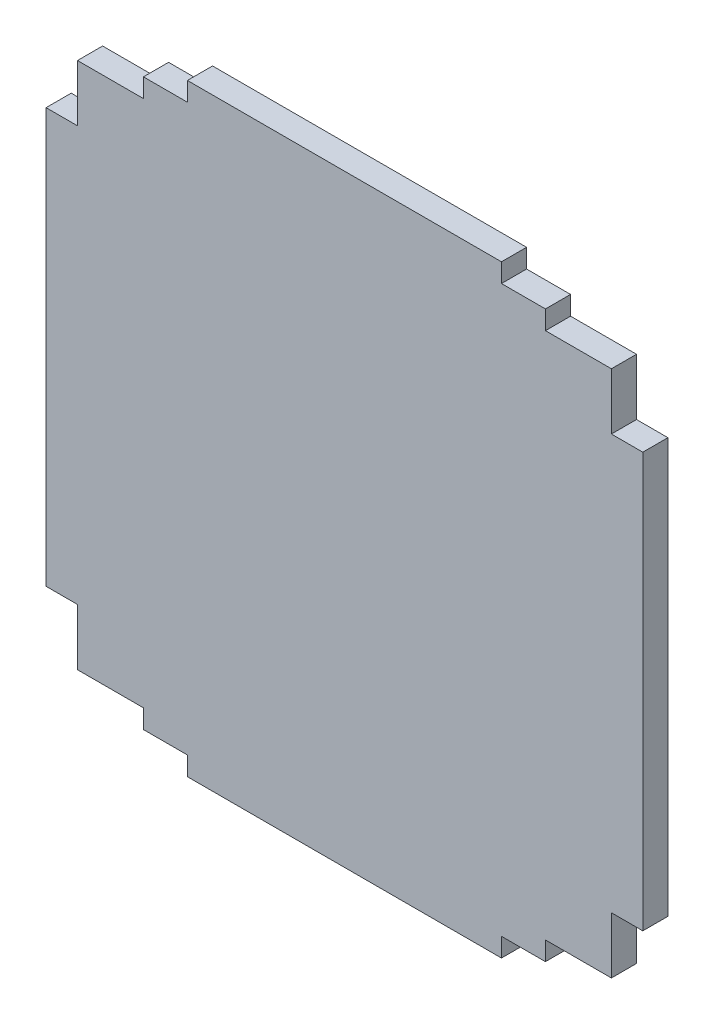
ISO-10303-21;
HEADER;
FILE_DESCRIPTION(('STEP AP214'),'2;1');
FILE_NAME('part.step','',(''),(''),'','','');
FILE_SCHEMA(('AUTOMOTIVE_DESIGN { 1 0 10303 214 1 1 1 1 }'));
ENDSEC;
DATA;
#1=APPLICATION_CONTEXT('core data for automotive mechanical design processes');
#2=APPLICATION_PROTOCOL_DEFINITION('international standard','automotive_design',2000,#1);
#3=PRODUCT_CONTEXT('',#1,'mechanical');
#4=PRODUCT('Part','Part','',(#3));
#5=PRODUCT_RELATED_PRODUCT_CATEGORY('part','',(#4));
#6=PRODUCT_DEFINITION_FORMATION('','',#4);
#7=PRODUCT_DEFINITION_CONTEXT('part definition',#1,'design');
#8=PRODUCT_DEFINITION('design','',#6,#7);
#9=PRODUCT_DEFINITION_SHAPE('','',#8);
#10=(LENGTH_UNIT() NAMED_UNIT(*) SI_UNIT(.MILLI.,.METRE.));
#11=(NAMED_UNIT(*) PLANE_ANGLE_UNIT() SI_UNIT($,.RADIAN.));
#12=(NAMED_UNIT(*) SI_UNIT($,.STERADIAN.) SOLID_ANGLE_UNIT());
#13=UNCERTAINTY_MEASURE_WITH_UNIT(LENGTH_MEASURE(1.E-05),#10,'distance_accuracy_value','');
#14=(GEOMETRIC_REPRESENTATION_CONTEXT(3) GLOBAL_UNCERTAINTY_ASSIGNED_CONTEXT((#13)) GLOBAL_UNIT_ASSIGNED_CONTEXT((#10,
#11,#12)) REPRESENTATION_CONTEXT('',''));
#15=CARTESIAN_POINT('',(0.,0.,0.));
#16=DIRECTION('',(0.,0.,1.));
#17=DIRECTION('',(1.,0.,0.));
#18=AXIS2_PLACEMENT_3D('',#15,#16,#17);
#19=CARTESIAN_POINT('',(42.185985468852,-41.9999998962809,4.));
#20=DIRECTION('',(-0.999999999999999,3.79117308534226E-08,0.));
#21=DIRECTION('',(-3.79117308534226E-08,-0.999999999999999,0.));
#22=AXIS2_PLACEMENT_3D('',#19,#20,#21);
#23=PLANE('',#22);
#24=DIRECTION('',(3.79117308534226E-08,0.999999999999999,0.));
#25=VECTOR('',#24,1.);
#26=CARTESIAN_POINT('',(42.185985468852,-41.9999998962809,0.));
#27=LINE('',#26,#25);
#28=CARTESIAN_POINT('',(42.185985468852,-41.9999998962809,0.));
#29=VERTEX_POINT('',#28);
#30=CARTESIAN_POINT('',(42.1859858100575,-32.9999998962809,0.));
#31=VERTEX_POINT('',#30);
#32=EDGE_CURVE('E255',#29,#31,#27,.T.);
#33=ORIENTED_EDGE('',*,*,#32,.T.);
#34=DIRECTION('',(0.,0.,-1.));
#35=VECTOR('',#34,1.);
#36=CARTESIAN_POINT('',(42.1859858100575,-32.9999998962809,4.));
#37=LINE('',#36,#35);
#38=CARTESIAN_POINT('',(42.1859858100575,-32.9999998962809,4.));
#39=VERTEX_POINT('',#38);
#40=EDGE_CURVE('E11',#39,#31,#37,.T.);
#41=ORIENTED_EDGE('',*,*,#40,.F.);
#42=DIRECTION('',(3.79117308534226E-08,0.999999999999999,0.));
#43=VECTOR('',#42,1.);
#44=CARTESIAN_POINT('',(42.185985468852,-41.9999998962809,4.));
#45=LINE('',#44,#43);
#46=CARTESIAN_POINT('',(42.185985468852,-41.9999998962809,4.));
#47=VERTEX_POINT('',#46);
#48=EDGE_CURVE('E309',#47,#39,#45,.T.);
#49=ORIENTED_EDGE('',*,*,#48,.F.);
#50=DIRECTION('',(0.,0.,-1.));
#51=VECTOR('',#50,1.);
#52=CARTESIAN_POINT('',(42.185985468852,-41.9999998962809,4.));
#53=LINE('',#52,#51);
#54=EDGE_CURVE('E251',#47,#29,#53,.T.);
#55=ORIENTED_EDGE('',*,*,#54,.T.);
#56=EDGE_LOOP('',(#33,#41,#49,#55));
#57=FACE_BOUND('',#56,.T.);
#58=ADVANCED_FACE('F39',(#57),#23,.F.);
#59=CARTESIAN_POINT('',(42.1859858100575,-32.9999998962809,4.));
#60=DIRECTION('',(3.57590861161203E-09,1.,0.));
#61=DIRECTION('',(-1.,3.57590861161203E-09,0.));
#62=AXIS2_PLACEMENT_3D('',#59,#60,#61);
#63=PLANE('',#62);
#64=DIRECTION('',(1.,-3.57590861161203E-09,0.));
#65=VECTOR('',#64,1.);
#66=CARTESIAN_POINT('',(42.1859858100575,-32.9999998962809,0.));
#67=LINE('',#66,#65);
#68=CARTESIAN_POINT('',(47.1859883122317,-32.9999999141604,0.));
#69=VERTEX_POINT('',#68);
#70=EDGE_CURVE('E258',#31,#69,#67,.T.);
#71=ORIENTED_EDGE('',*,*,#70,.T.);
#72=DIRECTION('',(0.,0.,-1.));
#73=VECTOR('',#72,1.);
#74=CARTESIAN_POINT('',(47.1859883122317,-32.9999999141604,4.));
#75=LINE('',#74,#73);
#76=CARTESIAN_POINT('',(47.1859883122317,-32.9999999141604,4.));
#77=VERTEX_POINT('',#76);
#78=EDGE_CURVE('E47',#77,#69,#75,.T.);
#79=ORIENTED_EDGE('',*,*,#78,.F.);
#80=DIRECTION('',(1.,-3.57590861161203E-09,0.));
#81=VECTOR('',#80,1.);
#82=CARTESIAN_POINT('',(42.1859858100575,-32.9999998962809,4.));
#83=LINE('',#82,#81);
#84=EDGE_CURVE('E158',#39,#77,#83,.T.);
#85=ORIENTED_EDGE('',*,*,#84,.F.);
#86=ORIENTED_EDGE('',*,*,#40,.T.);
#87=EDGE_LOOP('',(#71,#79,#85,#86));
#88=FACE_BOUND('',#87,.T.);
#89=ADVANCED_FACE('F467',(#88),#63,.F.);
#90=CARTESIAN_POINT('',(47.1859858100575,33.0000000858395,4.));
#91=DIRECTION('',(-0.999999999999999,-3.79117300473895E-08,0.));
#92=DIRECTION('',(3.79117300473895E-08,-0.999999999999999,0.));
#93=AXIS2_PLACEMENT_3D('',#90,#91,#92);
#94=PLANE('',#93);
#95=DIRECTION('',(-3.79117300473895E-08,0.999999999999999,0.));
#96=VECTOR('',#95,1.);
#97=CARTESIAN_POINT('',(47.1859858100575,33.0000000858395,0.));
#98=LINE('',#97,#96);
#99=CARTESIAN_POINT('',(47.1859858100575,33.0000000858395,0.));
#100=VERTEX_POINT('',#99);
#101=EDGE_CURVE('E260',#69,#100,#98,.T.);
#102=ORIENTED_EDGE('',*,*,#101,.T.);
#103=DIRECTION('',(0.,0.,-1.));
#104=VECTOR('',#103,1.);
#105=CARTESIAN_POINT('',(47.1859858100575,33.0000000858395,4.));
#106=LINE('',#105,#104);
#107=CARTESIAN_POINT('',(47.1859858100575,33.0000000858395,4.));
#108=VERTEX_POINT('',#107);
#109=EDGE_CURVE('E376',#108,#100,#106,.T.);
#110=ORIENTED_EDGE('',*,*,#109,.F.);
#111=DIRECTION('',(-3.79117300473895E-08,0.999999999999999,0.));
#112=VECTOR('',#111,1.);
#113=CARTESIAN_POINT('',(47.1859858100575,33.0000000858395,4.));
#114=LINE('',#113,#112);
#115=EDGE_CURVE('E384',#77,#108,#114,.T.);
#116=ORIENTED_EDGE('',*,*,#115,.F.);
#117=ORIENTED_EDGE('',*,*,#78,.T.);
#118=EDGE_LOOP('',(#102,#110,#116,#117));
#119=FACE_BOUND('',#118,.T.);
#120=ADVANCED_FACE('F382',(#119),#94,.F.);
#121=CARTESIAN_POINT('',(42.1859858100575,32.9999998962809,4.));
#122=DIRECTION('',(3.79117293114462E-08,-0.999999999999999,0.));
#123=DIRECTION('',(0.999999999999999,3.79117293114462E-08,0.));
#124=AXIS2_PLACEMENT_3D('',#121,#122,#123);
#125=PLANE('',#124);
#126=DIRECTION('',(-0.999999999999999,-3.79117293114462E-08,0.));
#127=VECTOR('',#126,1.);
#128=CARTESIAN_POINT('',(42.1859858100575,32.9999998962809,0.));
#129=LINE('',#128,#127);
#130=CARTESIAN_POINT('',(42.1859858100575,32.9999998962809,0.));
#131=VERTEX_POINT('',#130);
#132=EDGE_CURVE('E262',#100,#131,#129,.T.);
#133=ORIENTED_EDGE('',*,*,#132,.T.);
#134=DIRECTION('',(0.,0.,-1.));
#135=VECTOR('',#134,1.);
#136=CARTESIAN_POINT('',(42.1859858100575,32.9999998962809,4.));
#137=LINE('',#136,#135);
#138=CARTESIAN_POINT('',(42.1859858100575,32.9999998962809,4.));
#139=VERTEX_POINT('',#138);
#140=EDGE_CURVE('E373',#139,#131,#137,.T.);
#141=ORIENTED_EDGE('',*,*,#140,.F.);
#142=DIRECTION('',(-0.999999999999999,-3.79117293114462E-08,0.));
#143=VECTOR('',#142,1.);
#144=CARTESIAN_POINT('',(42.1859858100575,32.9999998962809,4.));
#145=LINE('',#144,#143);
#146=EDGE_CURVE('E402',#108,#139,#145,.T.);
#147=ORIENTED_EDGE('',*,*,#146,.F.);
#148=ORIENTED_EDGE('',*,*,#109,.T.);
#149=EDGE_LOOP('',(#133,#141,#147,#148));
#150=FACE_BOUND('',#149,.T.);
#151=ADVANCED_FACE('F393',(#150),#125,.F.);
#152=CARTESIAN_POINT('',(42.185985468852,41.9999998962809,4.));
#153=DIRECTION('',(-0.999999999999999,-3.79117308534226E-08,0.));
#154=DIRECTION('',(3.79117308534226E-08,-0.999999999999999,0.));
#155=AXIS2_PLACEMENT_3D('',#152,#153,#154);
#156=PLANE('',#155);
#157=DIRECTION('',(-3.79117308534226E-08,0.999999999999999,0.));
#158=VECTOR('',#157,1.);
#159=CARTESIAN_POINT('',(42.185985468852,41.9999998962809,0.));
#160=LINE('',#159,#158);
#161=CARTESIAN_POINT('',(42.185985468852,41.9999998962809,0.));
#162=VERTEX_POINT('',#161);
#163=EDGE_CURVE('E264',#131,#162,#160,.T.);
#164=ORIENTED_EDGE('',*,*,#163,.T.);
#165=DIRECTION('',(0.,0.,-1.));
#166=VECTOR('',#165,1.);
#167=CARTESIAN_POINT('',(42.185985468852,41.9999998962809,4.));
#168=LINE('',#167,#166);
#169=CARTESIAN_POINT('',(42.185985468852,41.9999998962809,4.));
#170=VERTEX_POINT('',#169);
#171=EDGE_CURVE('E370',#170,#162,#168,.T.);
#172=ORIENTED_EDGE('',*,*,#171,.F.);
#173=DIRECTION('',(-3.79117308534226E-08,0.999999999999999,0.));
#174=VECTOR('',#173,1.);
#175=CARTESIAN_POINT('',(42.185985468852,41.9999998962809,4.));
#176=LINE('',#175,#174);
#177=EDGE_CURVE('E399',#139,#170,#176,.T.);
#178=ORIENTED_EDGE('',*,*,#177,.F.);
#179=ORIENTED_EDGE('',*,*,#140,.T.);
#180=EDGE_LOOP('',(#164,#172,#178,#179));
#181=FACE_BOUND('',#180,.T.);
#182=ADVANCED_FACE('F397',(#181),#156,.F.);
#183=CARTESIAN_POINT('',(31.6859854688523,41.9999994982078,4.));
#184=DIRECTION('',(3.79117200595888E-08,-0.999999999999999,0.));
#185=DIRECTION('',(0.999999999999999,3.79117200595888E-08,0.));
#186=AXIS2_PLACEMENT_3D('',#183,#184,#185);
#187=PLANE('',#186);
#188=DIRECTION('',(-0.999999999999999,-3.79117200595888E-08,0.));
#189=VECTOR('',#188,1.);
#190=CARTESIAN_POINT('',(31.6859854688523,41.9999994982078,0.));
#191=LINE('',#190,#189);
#192=CARTESIAN_POINT('',(31.6859854688523,41.9999994982078,0.));
#193=VERTEX_POINT('',#192);
#194=EDGE_CURVE('E266',#162,#193,#191,.T.);
#195=ORIENTED_EDGE('',*,*,#194,.T.);
#196=DIRECTION('',(0.,0.,-1.));
#197=VECTOR('',#196,1.);
#198=CARTESIAN_POINT('',(31.6859854688523,41.9999994982078,4.));
#199=LINE('',#198,#197);
#200=CARTESIAN_POINT('',(31.6859854688523,41.9999994982078,4.));
#201=VERTEX_POINT('',#200);
#202=EDGE_CURVE('E367',#201,#193,#199,.T.);
#203=ORIENTED_EDGE('',*,*,#202,.F.);
#204=DIRECTION('',(-0.999999999999999,-3.79117200595888E-08,0.));
#205=VECTOR('',#204,1.);
#206=CARTESIAN_POINT('',(31.6859854688523,41.9999994982078,4.));
#207=LINE('',#206,#205);
#208=EDGE_CURVE('E401',#170,#201,#207,.T.);
#209=ORIENTED_EDGE('',*,*,#208,.F.);
#210=ORIENTED_EDGE('',*,*,#171,.T.);
#211=EDGE_LOOP('',(#195,#203,#209,#210));
#212=FACE_BOUND('',#211,.T.);
#213=ADVANCED_FACE('F480',(#212),#187,.F.);
#214=CARTESIAN_POINT('',(31.6859853551171,44.9999994982078,4.));
#215=DIRECTION('',(-0.999999999999999,-3.79117293114463E-08,0.));
#216=DIRECTION('',(3.79117293114463E-08,-0.999999999999999,0.));
#217=AXIS2_PLACEMENT_3D('',#214,#215,#216);
#218=PLANE('',#217);
#219=DIRECTION('',(-3.79117293114463E-08,0.999999999999999,0.));
#220=VECTOR('',#219,1.);
#221=CARTESIAN_POINT('',(31.6859853551171,44.9999994982078,0.));
#222=LINE('',#221,#220);
#223=CARTESIAN_POINT('',(31.6859853551171,44.9999994982078,0.));
#224=VERTEX_POINT('',#223);
#225=EDGE_CURVE('E268',#193,#224,#222,.T.);
#226=ORIENTED_EDGE('',*,*,#225,.T.);
#227=DIRECTION('',(0.,0.,-1.));
#228=VECTOR('',#227,1.);
#229=CARTESIAN_POINT('',(31.6859853551171,44.9999994982078,4.));
#230=LINE('',#229,#228);
#231=CARTESIAN_POINT('',(31.6859853551171,44.9999994982078,4.));
#232=VERTEX_POINT('',#231);
#233=EDGE_CURVE('E364',#232,#224,#230,.T.);
#234=ORIENTED_EDGE('',*,*,#233,.F.);
#235=DIRECTION('',(-3.79117293114463E-08,0.999999999999999,0.));
#236=VECTOR('',#235,1.);
#237=CARTESIAN_POINT('',(31.6859853551171,44.9999994982078,4.));
#238=LINE('',#237,#236);
#239=EDGE_CURVE('E404',#201,#232,#238,.T.);
#240=ORIENTED_EDGE('',*,*,#239,.F.);
#241=ORIENTED_EDGE('',*,*,#202,.T.);
#242=EDGE_LOOP('',(#226,#234,#240,#241));
#243=FACE_BOUND('',#242,.T.);
#244=ADVANCED_FACE('F483',(#243),#218,.F.);
#245=CARTESIAN_POINT('',(24.6859853551169,44.9999992328257,4.));
#246=DIRECTION('',(3.79117303027153E-08,-0.999999999999999,0.));
#247=DIRECTION('',(0.999999999999999,3.79117303027153E-08,0.));
#248=AXIS2_PLACEMENT_3D('',#245,#246,#247);
#249=PLANE('',#248);
#250=DIRECTION('',(-0.999999999999999,-3.79117303027153E-08,0.));
#251=VECTOR('',#250,1.);
#252=CARTESIAN_POINT('',(24.6859853551169,44.9999992328257,0.));
#253=LINE('',#252,#251);
#254=CARTESIAN_POINT('',(24.6859853551169,44.9999992328257,0.));
#255=VERTEX_POINT('',#254);
#256=EDGE_CURVE('E270',#224,#255,#253,.T.);
#257=ORIENTED_EDGE('',*,*,#256,.T.);
#258=DIRECTION('',(0.,0.,-1.));
#259=VECTOR('',#258,1.);
#260=CARTESIAN_POINT('',(24.6859853551169,44.9999992328257,4.));
#261=LINE('',#260,#259);
#262=CARTESIAN_POINT('',(24.6859853551169,44.9999992328257,4.));
#263=VERTEX_POINT('',#262);
#264=EDGE_CURVE('E361',#263,#255,#261,.T.);
#265=ORIENTED_EDGE('',*,*,#264,.F.);
#266=DIRECTION('',(-0.999999999999999,-3.79117303027153E-08,0.));
#267=VECTOR('',#266,1.);
#268=CARTESIAN_POINT('',(24.6859853551169,44.9999992328257,4.));
#269=LINE('',#268,#267);
#270=EDGE_CURVE('E410',#232,#263,#269,.T.);
#271=ORIENTED_EDGE('',*,*,#270,.F.);
#272=ORIENTED_EDGE('',*,*,#233,.T.);
#273=EDGE_LOOP('',(#257,#265,#271,#272));
#274=FACE_BOUND('',#273,.T.);
#275=ADVANCED_FACE('F487',(#274),#249,.F.);
#276=CARTESIAN_POINT('',(24.6859852413817,47.9999992328257,4.));
#277=DIRECTION('',(-0.999999999999999,-3.79117293114461E-08,0.));
#278=DIRECTION('',(3.79117293114461E-08,-0.999999999999999,0.));
#279=AXIS2_PLACEMENT_3D('',#276,#277,#278);
#280=PLANE('',#279);
#281=DIRECTION('',(-3.79117293114461E-08,0.999999999999999,0.));
#282=VECTOR('',#281,1.);
#283=CARTESIAN_POINT('',(24.6859852413817,47.9999992328257,0.));
#284=LINE('',#283,#282);
#285=CARTESIAN_POINT('',(24.6859852413817,47.9999992328257,0.));
#286=VERTEX_POINT('',#285);
#287=EDGE_CURVE('E272',#255,#286,#284,.T.);
#288=ORIENTED_EDGE('',*,*,#287,.T.);
#289=DIRECTION('',(0.,0.,-1.));
#290=VECTOR('',#289,1.);
#291=CARTESIAN_POINT('',(24.6859852413817,47.9999992328257,4.));
#292=LINE('',#291,#290);
#293=CARTESIAN_POINT('',(24.6859852413817,47.9999992328257,4.));
#294=VERTEX_POINT('',#293);
#295=EDGE_CURVE('E358',#294,#286,#292,.T.);
#296=ORIENTED_EDGE('',*,*,#295,.F.);
#297=DIRECTION('',(-3.79117293114461E-08,0.999999999999999,0.));
#298=VECTOR('',#297,1.);
#299=CARTESIAN_POINT('',(24.6859852413817,47.9999992328257,4.));
#300=LINE('',#299,#298);
#301=EDGE_CURVE('E412',#263,#294,#300,.T.);
#302=ORIENTED_EDGE('',*,*,#301,.F.);
#303=ORIENTED_EDGE('',*,*,#264,.T.);
#304=EDGE_LOOP('',(#288,#296,#302,#303));
#305=FACE_BOUND('',#304,.T.);
#306=ADVANCED_FACE('F491',(#305),#280,.F.);
#307=CARTESIAN_POINT('',(-25.3140147586183,47.9999973372392,4.));
#308=DIRECTION('',(3.79117302828913E-08,-0.999999999999999,0.));
#309=DIRECTION('',(0.999999999999999,3.79117302828913E-08,0.));
#310=AXIS2_PLACEMENT_3D('',#307,#308,#309);
#311=PLANE('',#310);
#312=DIRECTION('',(-0.999999999999999,-3.79117302828913E-08,0.));
#313=VECTOR('',#312,1.);
#314=CARTESIAN_POINT('',(-25.3140147586183,47.9999973372392,0.));
#315=LINE('',#314,#313);
#316=CARTESIAN_POINT('',(-25.3140147586183,47.9999973372392,0.));
#317=VERTEX_POINT('',#316);
#318=EDGE_CURVE('E274',#286,#317,#315,.T.);
#319=ORIENTED_EDGE('',*,*,#318,.T.);
#320=DIRECTION('',(0.,0.,-1.));
#321=VECTOR('',#320,1.);
#322=CARTESIAN_POINT('',(-25.3140147586183,47.9999973372392,4.));
#323=LINE('',#322,#321);
#324=CARTESIAN_POINT('',(-25.3140147586183,47.9999973372392,4.));
#325=VERTEX_POINT('',#324);
#326=EDGE_CURVE('E355',#325,#317,#323,.T.);
#327=ORIENTED_EDGE('',*,*,#326,.F.);
#328=DIRECTION('',(-0.999999999999999,-3.79117302828913E-08,0.));
#329=VECTOR('',#328,1.);
#330=CARTESIAN_POINT('',(-25.3140147586183,47.9999973372392,4.));
#331=LINE('',#330,#329);
#332=EDGE_CURVE('E414',#294,#325,#331,.T.);
#333=ORIENTED_EDGE('',*,*,#332,.F.);
#334=ORIENTED_EDGE('',*,*,#295,.T.);
#335=EDGE_LOOP('',(#319,#327,#333,#334));
#336=FACE_BOUND('',#335,.T.);
#337=ADVANCED_FACE('F495',(#336),#311,.F.);
#338=CARTESIAN_POINT('',(-25.3140146448831,44.9999973372392,4.));
#339=DIRECTION('',(0.999999999999999,3.79117304679285E-08,0.));
#340=DIRECTION('',(-3.79117304679285E-08,0.999999999999999,0.));
#341=AXIS2_PLACEMENT_3D('',#338,#339,#340);
#342=PLANE('',#341);
#343=DIRECTION('',(3.79117304679285E-08,-0.999999999999999,0.));
#344=VECTOR('',#343,1.);
#345=CARTESIAN_POINT('',(-25.3140146448831,44.9999973372392,0.));
#346=LINE('',#345,#344);
#347=CARTESIAN_POINT('',(-25.3140146448831,44.9999973372392,0.));
#348=VERTEX_POINT('',#347);
#349=EDGE_CURVE('E276',#317,#348,#346,.T.);
#350=ORIENTED_EDGE('',*,*,#349,.T.);
#351=DIRECTION('',(0.,0.,-1.));
#352=VECTOR('',#351,1.);
#353=CARTESIAN_POINT('',(-25.3140146448831,44.9999973372392,4.));
#354=LINE('',#353,#352);
#355=CARTESIAN_POINT('',(-25.3140146448831,44.9999973372392,4.));
#356=VERTEX_POINT('',#355);
#357=EDGE_CURVE('E352',#356,#348,#354,.T.);
#358=ORIENTED_EDGE('',*,*,#357,.F.);
#359=DIRECTION('',(3.79117304679285E-08,-0.999999999999999,0.));
#360=VECTOR('',#359,1.);
#361=CARTESIAN_POINT('',(-25.3140146448831,44.9999973372392,4.));
#362=LINE('',#361,#360);
#363=EDGE_CURVE('E416',#325,#356,#362,.T.);
#364=ORIENTED_EDGE('',*,*,#363,.F.);
#365=ORIENTED_EDGE('',*,*,#326,.T.);
#366=EDGE_LOOP('',(#350,#358,#364,#365));
#367=FACE_BOUND('',#366,.T.);
#368=ADVANCED_FACE('F499',(#367),#342,.F.);
#369=CARTESIAN_POINT('',(-32.3140146448834,44.9999970718571,4.));
#370=DIRECTION('',(3.79117303027152E-08,-0.999999999999999,0.));
#371=DIRECTION('',(0.999999999999999,3.79117303027152E-08,0.));
#372=AXIS2_PLACEMENT_3D('',#369,#370,#371);
#373=PLANE('',#372);
#374=DIRECTION('',(-0.999999999999999,-3.79117303027152E-08,0.));
#375=VECTOR('',#374,1.);
#376=CARTESIAN_POINT('',(-32.3140146448834,44.9999970718571,0.));
#377=LINE('',#376,#375);
#378=CARTESIAN_POINT('',(-32.3140146448834,44.9999970718571,0.));
#379=VERTEX_POINT('',#378);
#380=EDGE_CURVE('E278',#348,#379,#377,.T.);
#381=ORIENTED_EDGE('',*,*,#380,.T.);
#382=DIRECTION('',(0.,0.,-1.));
#383=VECTOR('',#382,1.);
#384=CARTESIAN_POINT('',(-32.3140146448834,44.9999970718571,4.));
#385=LINE('',#384,#383);
#386=CARTESIAN_POINT('',(-32.3140146448834,44.9999970718571,4.));
#387=VERTEX_POINT('',#386);
#388=EDGE_CURVE('E349',#387,#379,#385,.T.);
#389=ORIENTED_EDGE('',*,*,#388,.F.);
#390=DIRECTION('',(-0.999999999999999,-3.79117303027152E-08,0.));
#391=VECTOR('',#390,1.);
#392=CARTESIAN_POINT('',(-32.3140146448834,44.9999970718571,4.));
#393=LINE('',#392,#391);
#394=EDGE_CURVE('E418',#356,#387,#393,.T.);
#395=ORIENTED_EDGE('',*,*,#394,.F.);
#396=ORIENTED_EDGE('',*,*,#357,.T.);
#397=EDGE_LOOP('',(#381,#389,#395,#396));
#398=FACE_BOUND('',#397,.T.);
#399=ADVANCED_FACE('F503',(#398),#373,.F.);
#400=CARTESIAN_POINT('',(-32.3140145311482,41.9999970718571,4.));
#401=DIRECTION('',(0.999999999999999,3.79117316244108E-08,0.));
#402=DIRECTION('',(-3.79117316244108E-08,0.999999999999999,0.));
#403=AXIS2_PLACEMENT_3D('',#400,#401,#402);
#404=PLANE('',#403);
#405=DIRECTION('',(3.79117316244108E-08,-0.999999999999999,0.));
#406=VECTOR('',#405,1.);
#407=CARTESIAN_POINT('',(-32.3140145311482,41.9999970718571,0.));
#408=LINE('',#407,#406);
#409=CARTESIAN_POINT('',(-32.3140145311482,41.9999970718571,0.));
#410=VERTEX_POINT('',#409);
#411=EDGE_CURVE('E280',#379,#410,#408,.T.);
#412=ORIENTED_EDGE('',*,*,#411,.T.);
#413=DIRECTION('',(0.,0.,-1.));
#414=VECTOR('',#413,1.);
#415=CARTESIAN_POINT('',(-32.3140145311482,41.9999970718571,4.));
#416=LINE('',#415,#414);
#417=CARTESIAN_POINT('',(-32.3140145311482,41.9999970718571,4.));
#418=VERTEX_POINT('',#417);
#419=EDGE_CURVE('E346',#418,#410,#416,.T.);
#420=ORIENTED_EDGE('',*,*,#419,.F.);
#421=DIRECTION('',(3.79117316244108E-08,-0.999999999999999,0.));
#422=VECTOR('',#421,1.);
#423=CARTESIAN_POINT('',(-32.3140145311482,41.9999970718571,4.));
#424=LINE('',#423,#422);
#425=EDGE_CURVE('E420',#387,#418,#424,.T.);
#426=ORIENTED_EDGE('',*,*,#425,.F.);
#427=ORIENTED_EDGE('',*,*,#388,.T.);
#428=EDGE_LOOP('',(#412,#420,#426,#427));
#429=FACE_BOUND('',#428,.T.);
#430=ADVANCED_FACE('F507',(#429),#404,.F.);
#431=CARTESIAN_POINT('',(-42.814014531148,41.9999966737837,4.));
#432=DIRECTION('',(3.79117484760109E-08,-0.999999999999999,0.));
#433=DIRECTION('',(0.999999999999999,3.79117484760109E-08,0.));
#434=AXIS2_PLACEMENT_3D('',#431,#432,#433);
#435=PLANE('',#434);
#436=DIRECTION('',(-0.999999999999999,-3.79117484760109E-08,0.));
#437=VECTOR('',#436,1.);
#438=CARTESIAN_POINT('',(-42.814014531148,41.9999966737837,0.));
#439=LINE('',#438,#437);
#440=CARTESIAN_POINT('',(-42.814014531148,41.9999966737837,0.));
#441=VERTEX_POINT('',#440);
#442=EDGE_CURVE('E282',#410,#441,#439,.T.);
#443=ORIENTED_EDGE('',*,*,#442,.T.);
#444=DIRECTION('',(0.,0.,-1.));
#445=VECTOR('',#444,1.);
#446=CARTESIAN_POINT('',(-42.814014531148,41.9999966737837,4.));
#447=LINE('',#446,#445);
#448=CARTESIAN_POINT('',(-42.814014531148,41.9999966737837,4.));
#449=VERTEX_POINT('',#448);
#450=EDGE_CURVE('E343',#449,#441,#447,.T.);
#451=ORIENTED_EDGE('',*,*,#450,.F.);
#452=DIRECTION('',(-0.999999999999999,-3.79117484760109E-08,0.));
#453=VECTOR('',#452,1.);
#454=CARTESIAN_POINT('',(-42.814014531148,41.9999966737837,4.));
#455=LINE('',#454,#453);
#456=EDGE_CURVE('E422',#418,#449,#455,.T.);
#457=ORIENTED_EDGE('',*,*,#456,.F.);
#458=ORIENTED_EDGE('',*,*,#419,.T.);
#459=EDGE_LOOP('',(#443,#451,#457,#458));
#460=FACE_BOUND('',#459,.T.);
#461=ADVANCED_FACE('F511',(#460),#435,.F.);
#462=CARTESIAN_POINT('',(-42.8140141899426,32.9999966737837,4.));
#463=DIRECTION('',(0.999999999999999,3.79117108077292E-08,0.));
#464=DIRECTION('',(-3.79117108077292E-08,0.999999999999999,0.));
#465=AXIS2_PLACEMENT_3D('',#462,#463,#464);
#466=PLANE('',#465);
#467=DIRECTION('',(3.79117108077292E-08,-0.999999999999999,0.));
#468=VECTOR('',#467,1.);
#469=CARTESIAN_POINT('',(-42.8140141899426,32.9999966737837,0.));
#470=LINE('',#469,#468);
#471=CARTESIAN_POINT('',(-42.8140141899426,32.9999966737837,0.));
#472=VERTEX_POINT('',#471);
#473=EDGE_CURVE('E284',#441,#472,#470,.T.);
#474=ORIENTED_EDGE('',*,*,#473,.T.);
#475=DIRECTION('',(0.,0.,-1.));
#476=VECTOR('',#475,1.);
#477=CARTESIAN_POINT('',(-42.8140141899426,32.9999966737837,4.));
#478=LINE('',#477,#476);
#479=CARTESIAN_POINT('',(-42.8140141899426,32.9999966737837,4.));
#480=VERTEX_POINT('',#479);
#481=EDGE_CURVE('E340',#480,#472,#478,.T.);
#482=ORIENTED_EDGE('',*,*,#481,.F.);
#483=DIRECTION('',(3.79117108077292E-08,-0.999999999999999,0.));
#484=VECTOR('',#483,1.);
#485=CARTESIAN_POINT('',(-42.8140141899426,32.9999966737837,4.));
#486=LINE('',#485,#484);
#487=EDGE_CURVE('E424',#449,#480,#486,.T.);
#488=ORIENTED_EDGE('',*,*,#487,.F.);
#489=ORIENTED_EDGE('',*,*,#450,.T.);
#490=EDGE_LOOP('',(#474,#482,#488,#489));
#491=FACE_BOUND('',#490,.T.);
#492=ADVANCED_FACE('F515',(#491),#466,.F.);
#493=CARTESIAN_POINT('',(-47.8140141899424,32.9999964842251,4.));
#494=DIRECTION('',(3.79117320870051E-08,-0.999999999999999,0.));
#495=DIRECTION('',(0.999999999999999,3.79117320870051E-08,0.));
#496=AXIS2_PLACEMENT_3D('',#493,#494,#495);
#497=PLANE('',#496);
#498=DIRECTION('',(-0.999999999999999,-3.79117320870051E-08,0.));
#499=VECTOR('',#498,1.);
#500=CARTESIAN_POINT('',(-47.8140141899424,32.9999964842251,0.));
#501=LINE('',#500,#499);
#502=CARTESIAN_POINT('',(-47.8140141899424,32.9999964842251,0.));
#503=VERTEX_POINT('',#502);
#504=EDGE_CURVE('E286',#472,#503,#501,.T.);
#505=ORIENTED_EDGE('',*,*,#504,.T.);
#506=DIRECTION('',(0.,0.,-1.));
#507=VECTOR('',#506,1.);
#508=CARTESIAN_POINT('',(-47.8140141899424,32.9999964842251,4.));
#509=LINE('',#508,#507);
#510=CARTESIAN_POINT('',(-47.8140141899424,32.9999964842251,4.));
#511=VERTEX_POINT('',#510);
#512=EDGE_CURVE('E337',#511,#503,#509,.T.);
#513=ORIENTED_EDGE('',*,*,#512,.F.);
#514=DIRECTION('',(-0.999999999999999,-3.79117320870051E-08,0.));
#515=VECTOR('',#514,1.);
#516=CARTESIAN_POINT('',(-47.8140141899424,32.9999964842251,4.));
#517=LINE('',#516,#515);
#518=EDGE_CURVE('E426',#480,#511,#517,.T.);
#519=ORIENTED_EDGE('',*,*,#518,.F.);
#520=ORIENTED_EDGE('',*,*,#481,.T.);
#521=EDGE_LOOP('',(#505,#513,#519,#520));
#522=FACE_BOUND('',#521,.T.);
#523=ADVANCED_FACE('F519',(#522),#497,.F.);
#524=CARTESIAN_POINT('',(-47.8140141899424,32.9999964842251,4.));
#525=DIRECTION('',(1.,0.,0.));
#526=DIRECTION('',(0.,0.,-1.));
#527=AXIS2_PLACEMENT_3D('',#524,#525,#526);
#528=PLANE('',#527);
#529=DIRECTION('',(0.,-1.,0.));
#530=VECTOR('',#529,1.);
#531=CARTESIAN_POINT('',(-47.8140141899424,32.9999964842251,0.));
#532=LINE('',#531,#530);
#533=CARTESIAN_POINT('',(-47.8140141899424,-32.9999964842251,0.));
#534=VERTEX_POINT('',#533);
#535=EDGE_CURVE('E288',#503,#534,#532,.T.);
#536=ORIENTED_EDGE('',*,*,#535,.T.);
#537=DIRECTION('',(0.,0.,-1.));
#538=VECTOR('',#537,1.);
#539=CARTESIAN_POINT('',(-47.8140141899424,-32.9999964842251,4.));
#540=LINE('',#539,#538);
#541=CARTESIAN_POINT('',(-47.8140141899424,-32.9999964842251,4.));
#542=VERTEX_POINT('',#541);
#543=EDGE_CURVE('E334',#542,#534,#540,.T.);
#544=ORIENTED_EDGE('',*,*,#543,.F.);
#545=DIRECTION('',(0.,-1.,0.));
#546=VECTOR('',#545,1.);
#547=CARTESIAN_POINT('',(-47.8140141899424,32.9999964842251,4.));
#548=LINE('',#547,#546);
#549=EDGE_CURVE('E428',#511,#542,#548,.T.);
#550=ORIENTED_EDGE('',*,*,#549,.F.);
#551=ORIENTED_EDGE('',*,*,#512,.T.);
#552=EDGE_LOOP('',(#536,#544,#550,#551));
#553=FACE_BOUND('',#552,.T.);
#554=ADVANCED_FACE('F523',(#553),#528,.F.);
#555=CARTESIAN_POINT('',(-47.8140141899424,-32.9999964842251,4.));
#556=DIRECTION('',(3.79117320870051E-08,0.999999999999999,0.));
#557=DIRECTION('',(-0.999999999999999,3.79117320870051E-08,0.));
#558=AXIS2_PLACEMENT_3D('',#555,#556,#557);
#559=PLANE('',#558);
#560=DIRECTION('',(0.999999999999999,-3.79117320870051E-08,0.));
#561=VECTOR('',#560,1.);
#562=CARTESIAN_POINT('',(-47.8140141899424,-32.9999964842251,0.));
#563=LINE('',#562,#561);
#564=CARTESIAN_POINT('',(-42.8140141899426,-32.9999966737837,0.));
#565=VERTEX_POINT('',#564);
#566=EDGE_CURVE('E290',#534,#565,#563,.T.);
#567=ORIENTED_EDGE('',*,*,#566,.T.);
#568=DIRECTION('',(0.,0.,-1.));
#569=VECTOR('',#568,1.);
#570=CARTESIAN_POINT('',(-42.8140141899426,-32.9999966737837,4.));
#571=LINE('',#570,#569);
#572=CARTESIAN_POINT('',(-42.8140141899426,-32.9999966737837,4.));
#573=VERTEX_POINT('',#572);
#574=EDGE_CURVE('E331',#573,#565,#571,.T.);
#575=ORIENTED_EDGE('',*,*,#574,.F.);
#576=DIRECTION('',(0.999999999999999,-3.79117320870051E-08,0.));
#577=VECTOR('',#576,1.);
#578=CARTESIAN_POINT('',(-47.8140141899424,-32.9999964842251,4.));
#579=LINE('',#578,#577);
#580=EDGE_CURVE('E430',#542,#573,#579,.T.);
#581=ORIENTED_EDGE('',*,*,#580,.F.);
#582=ORIENTED_EDGE('',*,*,#543,.T.);
#583=EDGE_LOOP('',(#567,#575,#581,#582));
#584=FACE_BOUND('',#583,.T.);
#585=ADVANCED_FACE('F527',(#584),#559,.F.);
#586=CARTESIAN_POINT('',(-42.8140141899426,-32.9999966737837,4.));
#587=DIRECTION('',(0.999999999999999,-3.79117108077292E-08,0.));
#588=DIRECTION('',(3.79117108077292E-08,0.999999999999999,0.));
#589=AXIS2_PLACEMENT_3D('',#586,#587,#588);
#590=PLANE('',#589);
#591=DIRECTION('',(-3.79117108077292E-08,-0.999999999999999,0.));
#592=VECTOR('',#591,1.);
#593=CARTESIAN_POINT('',(-42.8140141899426,-32.9999966737837,0.));
#594=LINE('',#593,#592);
#595=CARTESIAN_POINT('',(-42.814014531148,-41.9999966737837,0.));
#596=VERTEX_POINT('',#595);
#597=EDGE_CURVE('E292',#565,#596,#594,.T.);
#598=ORIENTED_EDGE('',*,*,#597,.T.);
#599=DIRECTION('',(0.,0.,-1.));
#600=VECTOR('',#599,1.);
#601=CARTESIAN_POINT('',(-42.814014531148,-41.9999966737837,4.));
#602=LINE('',#601,#600);
#603=CARTESIAN_POINT('',(-42.814014531148,-41.9999966737837,4.));
#604=VERTEX_POINT('',#603);
#605=EDGE_CURVE('E328',#604,#596,#602,.T.);
#606=ORIENTED_EDGE('',*,*,#605,.F.);
#607=DIRECTION('',(-3.79117108077292E-08,-0.999999999999999,0.));
#608=VECTOR('',#607,1.);
#609=CARTESIAN_POINT('',(-42.8140141899426,-32.9999966737837,4.));
#610=LINE('',#609,#608);
#611=EDGE_CURVE('E432',#573,#604,#610,.T.);
#612=ORIENTED_EDGE('',*,*,#611,.F.);
#613=ORIENTED_EDGE('',*,*,#574,.T.);
#614=EDGE_LOOP('',(#598,#606,#612,#613));
#615=FACE_BOUND('',#614,.T.);
#616=ADVANCED_FACE('F531',(#615),#590,.F.);
#617=CARTESIAN_POINT('',(-42.814014531148,-41.9999966737837,4.));
#618=DIRECTION('',(3.79117484760109E-08,0.999999999999999,0.));
#619=DIRECTION('',(-0.999999999999999,3.79117484760109E-08,0.));
#620=AXIS2_PLACEMENT_3D('',#617,#618,#619);
#621=PLANE('',#620);
#622=DIRECTION('',(0.999999999999999,-3.79117484760109E-08,0.));
#623=VECTOR('',#622,1.);
#624=CARTESIAN_POINT('',(-42.814014531148,-41.9999966737837,0.));
#625=LINE('',#624,#623);
#626=CARTESIAN_POINT('',(-32.3140145311482,-41.9999970718571,0.));
#627=VERTEX_POINT('',#626);
#628=EDGE_CURVE('E294',#596,#627,#625,.T.);
#629=ORIENTED_EDGE('',*,*,#628,.T.);
#630=DIRECTION('',(0.,0.,-1.));
#631=VECTOR('',#630,1.);
#632=CARTESIAN_POINT('',(-32.3140145311482,-41.9999970718571,4.));
#633=LINE('',#632,#631);
#634=CARTESIAN_POINT('',(-32.3140145311482,-41.9999970718571,4.));
#635=VERTEX_POINT('',#634);
#636=EDGE_CURVE('E325',#635,#627,#633,.T.);
#637=ORIENTED_EDGE('',*,*,#636,.F.);
#638=DIRECTION('',(0.999999999999999,-3.79117484760109E-08,0.));
#639=VECTOR('',#638,1.);
#640=CARTESIAN_POINT('',(-42.814014531148,-41.9999966737837,4.));
#641=LINE('',#640,#639);
#642=EDGE_CURVE('E434',#604,#635,#641,.T.);
#643=ORIENTED_EDGE('',*,*,#642,.F.);
#644=ORIENTED_EDGE('',*,*,#605,.T.);
#645=EDGE_LOOP('',(#629,#637,#643,#644));
#646=FACE_BOUND('',#645,.T.);
#647=ADVANCED_FACE('F535',(#646),#621,.F.);
#648=CARTESIAN_POINT('',(-32.3140145311482,-41.9999970718571,4.));
#649=DIRECTION('',(0.999999999999999,-3.79117316244108E-08,0.));
#650=DIRECTION('',(3.79117316244108E-08,0.999999999999999,0.));
#651=AXIS2_PLACEMENT_3D('',#648,#649,#650);
#652=PLANE('',#651);
#653=DIRECTION('',(-3.79117316244108E-08,-0.999999999999999,0.));
#654=VECTOR('',#653,1.);
#655=CARTESIAN_POINT('',(-32.3140145311482,-41.9999970718571,0.));
#656=LINE('',#655,#654);
#657=CARTESIAN_POINT('',(-32.3140146448834,-44.9999970718571,0.));
#658=VERTEX_POINT('',#657);
#659=EDGE_CURVE('E296',#627,#658,#656,.T.);
#660=ORIENTED_EDGE('',*,*,#659,.T.);
#661=DIRECTION('',(0.,0.,-1.));
#662=VECTOR('',#661,1.);
#663=CARTESIAN_POINT('',(-32.3140146448834,-44.9999970718571,4.));
#664=LINE('',#663,#662);
#665=CARTESIAN_POINT('',(-32.3140146448834,-44.9999970718571,4.));
#666=VERTEX_POINT('',#665);
#667=EDGE_CURVE('E322',#666,#658,#664,.T.);
#668=ORIENTED_EDGE('',*,*,#667,.F.);
#669=DIRECTION('',(-3.79117316244108E-08,-0.999999999999999,0.));
#670=VECTOR('',#669,1.);
#671=CARTESIAN_POINT('',(-32.3140145311482,-41.9999970718571,4.));
#672=LINE('',#671,#670);
#673=EDGE_CURVE('E436',#635,#666,#672,.T.);
#674=ORIENTED_EDGE('',*,*,#673,.F.);
#675=ORIENTED_EDGE('',*,*,#636,.T.);
#676=EDGE_LOOP('',(#660,#668,#674,#675));
#677=FACE_BOUND('',#676,.T.);
#678=ADVANCED_FACE('F539',(#677),#652,.F.);
#679=CARTESIAN_POINT('',(-32.3140146448834,-44.9999970718571,4.));
#680=DIRECTION('',(3.79117303027152E-08,0.999999999999999,0.));
#681=DIRECTION('',(-0.999999999999999,3.79117303027152E-08,0.));
#682=AXIS2_PLACEMENT_3D('',#679,#680,#681);
#683=PLANE('',#682);
#684=DIRECTION('',(0.999999999999999,-3.79117303027152E-08,0.));
#685=VECTOR('',#684,1.);
#686=CARTESIAN_POINT('',(-32.3140146448834,-44.9999970718571,0.));
#687=LINE('',#686,#685);
#688=CARTESIAN_POINT('',(-25.3140146448831,-44.9999973372392,0.));
#689=VERTEX_POINT('',#688);
#690=EDGE_CURVE('E298',#658,#689,#687,.T.);
#691=ORIENTED_EDGE('',*,*,#690,.T.);
#692=DIRECTION('',(0.,0.,-1.));
#693=VECTOR('',#692,1.);
#694=CARTESIAN_POINT('',(-25.3140146448831,-44.9999973372392,4.));
#695=LINE('',#694,#693);
#696=CARTESIAN_POINT('',(-25.3140146448831,-44.9999973372392,4.));
#697=VERTEX_POINT('',#696);
#698=EDGE_CURVE('E319',#697,#689,#695,.T.);
#699=ORIENTED_EDGE('',*,*,#698,.F.);
#700=DIRECTION('',(0.999999999999999,-3.79117303027152E-08,0.));
#701=VECTOR('',#700,1.);
#702=CARTESIAN_POINT('',(-32.3140146448834,-44.9999970718571,4.));
#703=LINE('',#702,#701);
#704=EDGE_CURVE('E438',#666,#697,#703,.T.);
#705=ORIENTED_EDGE('',*,*,#704,.F.);
#706=ORIENTED_EDGE('',*,*,#667,.T.);
#707=EDGE_LOOP('',(#691,#699,#705,#706));
#708=FACE_BOUND('',#707,.T.);
#709=ADVANCED_FACE('F543',(#708),#683,.F.);
#710=CARTESIAN_POINT('',(-25.3140146448831,-44.9999973372392,4.));
#711=DIRECTION('',(0.999999999999999,-3.79117304679285E-08,0.));
#712=DIRECTION('',(3.79117304679285E-08,0.999999999999999,0.));
#713=AXIS2_PLACEMENT_3D('',#710,#711,#712);
#714=PLANE('',#713);
#715=DIRECTION('',(-3.79117304679285E-08,-0.999999999999999,0.));
#716=VECTOR('',#715,1.);
#717=CARTESIAN_POINT('',(-25.3140146448831,-44.9999973372392,0.));
#718=LINE('',#717,#716);
#719=CARTESIAN_POINT('',(-25.3140147586183,-47.9999973372392,0.));
#720=VERTEX_POINT('',#719);
#721=EDGE_CURVE('E300',#689,#720,#718,.T.);
#722=ORIENTED_EDGE('',*,*,#721,.T.);
#723=DIRECTION('',(0.,0.,-1.));
#724=VECTOR('',#723,1.);
#725=CARTESIAN_POINT('',(-25.3140147586183,-47.9999973372392,4.));
#726=LINE('',#725,#724);
#727=CARTESIAN_POINT('',(-25.3140147586183,-47.9999973372392,4.));
#728=VERTEX_POINT('',#727);
#729=EDGE_CURVE('E316',#728,#720,#726,.T.);
#730=ORIENTED_EDGE('',*,*,#729,.F.);
#731=DIRECTION('',(-3.79117304679285E-08,-0.999999999999999,0.));
#732=VECTOR('',#731,1.);
#733=CARTESIAN_POINT('',(-25.3140146448831,-44.9999973372392,4.));
#734=LINE('',#733,#732);
#735=EDGE_CURVE('E440',#697,#728,#734,.T.);
#736=ORIENTED_EDGE('',*,*,#735,.F.);
#737=ORIENTED_EDGE('',*,*,#698,.T.);
#738=EDGE_LOOP('',(#722,#730,#736,#737));
#739=FACE_BOUND('',#738,.T.);
#740=ADVANCED_FACE('F547',(#739),#714,.F.);
#741=CARTESIAN_POINT('',(-25.3140147586183,-47.9999973372392,4.));
#742=DIRECTION('',(3.79117302828913E-08,0.999999999999999,0.));
#743=DIRECTION('',(-0.999999999999999,3.79117302828913E-08,0.));
#744=AXIS2_PLACEMENT_3D('',#741,#742,#743);
#745=PLANE('',#744);
#746=DIRECTION('',(0.999999999999999,-3.79117302828913E-08,0.));
#747=VECTOR('',#746,1.);
#748=CARTESIAN_POINT('',(-25.3140147586183,-47.9999973372392,0.));
#749=LINE('',#748,#747);
#750=CARTESIAN_POINT('',(24.6859852413817,-47.9999992328257,0.));
#751=VERTEX_POINT('',#750);
#752=EDGE_CURVE('E302',#720,#751,#749,.T.);
#753=ORIENTED_EDGE('',*,*,#752,.T.);
#754=DIRECTION('',(0.,0.,-1.));
#755=VECTOR('',#754,1.);
#756=CARTESIAN_POINT('',(24.6859852413817,-47.9999992328257,4.));
#757=LINE('',#756,#755);
#758=CARTESIAN_POINT('',(24.6859852413817,-47.9999992328257,4.));
#759=VERTEX_POINT('',#758);
#760=EDGE_CURVE('E313',#759,#751,#757,.T.);
#761=ORIENTED_EDGE('',*,*,#760,.F.);
#762=DIRECTION('',(0.999999999999999,-3.79117302828913E-08,0.));
#763=VECTOR('',#762,1.);
#764=CARTESIAN_POINT('',(-25.3140147586183,-47.9999973372392,4.));
#765=LINE('',#764,#763);
#766=EDGE_CURVE('E442',#728,#759,#765,.T.);
#767=ORIENTED_EDGE('',*,*,#766,.F.);
#768=ORIENTED_EDGE('',*,*,#729,.T.);
#769=EDGE_LOOP('',(#753,#761,#767,#768));
#770=FACE_BOUND('',#769,.T.);
#771=ADVANCED_FACE('F448',(#770),#745,.F.);
#772=CARTESIAN_POINT('',(24.6859852413817,-47.9999992328257,4.));
#773=DIRECTION('',(-0.999999999999999,3.79117293114461E-08,0.));
#774=DIRECTION('',(-3.79117293114461E-08,-0.999999999999999,0.));
#775=AXIS2_PLACEMENT_3D('',#772,#773,#774);
#776=PLANE('',#775);
#777=DIRECTION('',(3.79117293114461E-08,0.999999999999999,0.));
#778=VECTOR('',#777,1.);
#779=CARTESIAN_POINT('',(24.6859852413817,-47.9999992328257,0.));
#780=LINE('',#779,#778);
#781=CARTESIAN_POINT('',(24.6859853551169,-44.9999992328257,0.));
#782=VERTEX_POINT('',#781);
#783=EDGE_CURVE('E304',#751,#782,#780,.T.);
#784=ORIENTED_EDGE('',*,*,#783,.T.);
#785=DIRECTION('',(0.,0.,-1.));
#786=VECTOR('',#785,1.);
#787=CARTESIAN_POINT('',(24.6859853551169,-44.9999992328257,4.));
#788=LINE('',#787,#786);
#789=CARTESIAN_POINT('',(24.6859853551169,-44.9999992328257,4.));
#790=VERTEX_POINT('',#789);
#791=EDGE_CURVE('E246',#790,#782,#788,.T.);
#792=ORIENTED_EDGE('',*,*,#791,.F.);
#793=DIRECTION('',(3.79117293114461E-08,0.999999999999999,0.));
#794=VECTOR('',#793,1.);
#795=CARTESIAN_POINT('',(24.6859852413817,-47.9999992328257,4.));
#796=LINE('',#795,#794);
#797=EDGE_CURVE('E237',#759,#790,#796,.T.);
#798=ORIENTED_EDGE('',*,*,#797,.F.);
#799=ORIENTED_EDGE('',*,*,#760,.T.);
#800=EDGE_LOOP('',(#784,#792,#798,#799));
#801=FACE_BOUND('',#800,.T.);
#802=ADVANCED_FACE('F452',(#801),#776,.F.);
#803=CARTESIAN_POINT('',(24.6859853551169,-44.9999992328257,4.));
#804=DIRECTION('',(3.79117303027153E-08,0.999999999999999,0.));
#805=DIRECTION('',(-0.999999999999999,3.79117303027153E-08,0.));
#806=AXIS2_PLACEMENT_3D('',#803,#804,#805);
#807=PLANE('',#806);
#808=DIRECTION('',(0.999999999999999,-3.79117303027153E-08,0.));
#809=VECTOR('',#808,1.);
#810=CARTESIAN_POINT('',(24.6859853551169,-44.9999992328257,0.));
#811=LINE('',#810,#809);
#812=CARTESIAN_POINT('',(31.6859853551171,-44.9999994982078,0.));
#813=VERTEX_POINT('',#812);
#814=EDGE_CURVE('E245',#782,#813,#811,.T.);
#815=ORIENTED_EDGE('',*,*,#814,.T.);
#816=DIRECTION('',(0.,0.,-1.));
#817=VECTOR('',#816,1.);
#818=CARTESIAN_POINT('',(31.6859853551171,-44.9999994982078,4.));
#819=LINE('',#818,#817);
#820=CARTESIAN_POINT('',(31.6859853551171,-44.9999994982078,4.));
#821=VERTEX_POINT('',#820);
#822=EDGE_CURVE('E242',#821,#813,#819,.T.);
#823=ORIENTED_EDGE('',*,*,#822,.F.);
#824=DIRECTION('',(0.999999999999999,-3.79117303027153E-08,0.));
#825=VECTOR('',#824,1.);
#826=CARTESIAN_POINT('',(24.6859853551169,-44.9999992328257,4.));
#827=LINE('',#826,#825);
#828=EDGE_CURVE('E231',#790,#821,#827,.T.);
#829=ORIENTED_EDGE('',*,*,#828,.F.);
#830=ORIENTED_EDGE('',*,*,#791,.T.);
#831=EDGE_LOOP('',(#815,#823,#829,#830));
#832=FACE_BOUND('',#831,.T.);
#833=ADVANCED_FACE('F243',(#832),#807,.F.);
#834=CARTESIAN_POINT('',(31.6859853551171,-44.9999994982078,4.));
#835=DIRECTION('',(-0.999999999999999,3.79117293114463E-08,0.));
#836=DIRECTION('',(-3.79117293114463E-08,-0.999999999999999,0.));
#837=AXIS2_PLACEMENT_3D('',#834,#835,#836);
#838=PLANE('',#837);
#839=DIRECTION('',(3.79117293114463E-08,0.999999999999999,0.));
#840=VECTOR('',#839,1.);
#841=CARTESIAN_POINT('',(31.6859853551171,-44.9999994982078,0.));
#842=LINE('',#841,#840);
#843=CARTESIAN_POINT('',(31.6859854688523,-41.9999994982078,0.));
#844=VERTEX_POINT('',#843);
#845=EDGE_CURVE('E144',#813,#844,#842,.T.);
#846=ORIENTED_EDGE('',*,*,#845,.T.);
#847=DIRECTION('',(0.,0.,-1.));
#848=VECTOR('',#847,1.);
#849=CARTESIAN_POINT('',(31.6859854688523,-41.9999994982078,4.));
#850=LINE('',#849,#848);
#851=CARTESIAN_POINT('',(31.6859854688523,-41.9999994982078,4.));
#852=VERTEX_POINT('',#851);
#853=EDGE_CURVE('E247',#852,#844,#850,.T.);
#854=ORIENTED_EDGE('',*,*,#853,.F.);
#855=DIRECTION('',(3.79117293114463E-08,0.999999999999999,0.));
#856=VECTOR('',#855,1.);
#857=CARTESIAN_POINT('',(31.6859853551171,-44.9999994982078,4.));
#858=LINE('',#857,#856);
#859=EDGE_CURVE('E235',#821,#852,#858,.T.);
#860=ORIENTED_EDGE('',*,*,#859,.F.);
#861=ORIENTED_EDGE('',*,*,#822,.T.);
#862=EDGE_LOOP('',(#846,#854,#860,#861));
#863=FACE_BOUND('',#862,.T.);
#864=ADVANCED_FACE('F249',(#863),#838,.F.);
#865=CARTESIAN_POINT('',(31.6859854688523,-41.9999994982078,4.));
#866=DIRECTION('',(3.79117200595888E-08,0.999999999999999,0.));
#867=DIRECTION('',(-0.999999999999999,3.79117200595888E-08,0.));
#868=AXIS2_PLACEMENT_3D('',#865,#866,#867);
#869=PLANE('',#868);
#870=DIRECTION('',(0.999999999999999,-3.79117200595888E-08,0.));
#871=VECTOR('',#870,1.);
#872=CARTESIAN_POINT('',(31.6859854688523,-41.9999994982078,0.));
#873=LINE('',#872,#871);
#874=EDGE_CURVE('E150',#844,#29,#873,.T.);
#875=ORIENTED_EDGE('',*,*,#874,.T.);
#876=ORIENTED_EDGE('',*,*,#54,.F.);
#877=DIRECTION('',(0.999999999999999,-3.79117200595888E-08,0.));
#878=VECTOR('',#877,1.);
#879=CARTESIAN_POINT('',(31.6859854688523,-41.9999994982078,4.));
#880=LINE('',#879,#878);
#881=EDGE_CURVE('E55',#852,#47,#880,.T.);
#882=ORIENTED_EDGE('',*,*,#881,.F.);
#883=ORIENTED_EDGE('',*,*,#853,.T.);
#884=EDGE_LOOP('',(#875,#876,#882,#883));
#885=FACE_BOUND('',#884,.T.);
#886=ADVANCED_FACE('F456',(#885),#869,.F.);
#887=CARTESIAN_POINT('',(0.,0.,4.));
#888=DIRECTION('',(0.,0.,-1.));
#889=DIRECTION('',(-1.,0.,0.));
#890=AXIS2_PLACEMENT_3D('',#887,#888,#889);
#891=PLANE('',#890);
#892=ORIENTED_EDGE('',*,*,#48,.T.);
#893=ORIENTED_EDGE('',*,*,#84,.T.);
#894=ORIENTED_EDGE('',*,*,#115,.T.);
#895=ORIENTED_EDGE('',*,*,#146,.T.);
#896=ORIENTED_EDGE('',*,*,#177,.T.);
#897=ORIENTED_EDGE('',*,*,#208,.T.);
#898=ORIENTED_EDGE('',*,*,#239,.T.);
#899=ORIENTED_EDGE('',*,*,#270,.T.);
#900=ORIENTED_EDGE('',*,*,#301,.T.);
#901=ORIENTED_EDGE('',*,*,#332,.T.);
#902=ORIENTED_EDGE('',*,*,#363,.T.);
#903=ORIENTED_EDGE('',*,*,#394,.T.);
#904=ORIENTED_EDGE('',*,*,#425,.T.);
#905=ORIENTED_EDGE('',*,*,#456,.T.);
#906=ORIENTED_EDGE('',*,*,#487,.T.);
#907=ORIENTED_EDGE('',*,*,#518,.T.);
#908=ORIENTED_EDGE('',*,*,#549,.T.);
#909=ORIENTED_EDGE('',*,*,#580,.T.);
#910=ORIENTED_EDGE('',*,*,#611,.T.);
#911=ORIENTED_EDGE('',*,*,#642,.T.);
#912=ORIENTED_EDGE('',*,*,#673,.T.);
#913=ORIENTED_EDGE('',*,*,#704,.T.);
#914=ORIENTED_EDGE('',*,*,#735,.T.);
#915=ORIENTED_EDGE('',*,*,#766,.T.);
#916=ORIENTED_EDGE('',*,*,#797,.T.);
#917=ORIENTED_EDGE('',*,*,#828,.T.);
#918=ORIENTED_EDGE('',*,*,#859,.T.);
#919=ORIENTED_EDGE('',*,*,#881,.T.);
#920=EDGE_LOOP('',(#892,#893,#894,#895,#896,#897,#898,#899,#900,#901,#902,#903,#904,#905,#906,
#907,#908,#909,#910,#911,#912,#913,#914,#915,#916,#917,#918,#919));
#921=FACE_BOUND('',#920,.T.);
#922=ADVANCED_FACE('F233',(#921),#891,.F.);
#923=CARTESIAN_POINT('',(0.,0.,0.));
#924=DIRECTION('',(0.,0.,-1.));
#925=DIRECTION('',(-1.,0.,0.));
#926=AXIS2_PLACEMENT_3D('',#923,#924,#925);
#927=PLANE('',#926);
#928=ORIENTED_EDGE('',*,*,#32,.F.);
#929=ORIENTED_EDGE('',*,*,#874,.F.);
#930=ORIENTED_EDGE('',*,*,#845,.F.);
#931=ORIENTED_EDGE('',*,*,#814,.F.);
#932=ORIENTED_EDGE('',*,*,#783,.F.);
#933=ORIENTED_EDGE('',*,*,#752,.F.);
#934=ORIENTED_EDGE('',*,*,#721,.F.);
#935=ORIENTED_EDGE('',*,*,#690,.F.);
#936=ORIENTED_EDGE('',*,*,#659,.F.);
#937=ORIENTED_EDGE('',*,*,#628,.F.);
#938=ORIENTED_EDGE('',*,*,#597,.F.);
#939=ORIENTED_EDGE('',*,*,#566,.F.);
#940=ORIENTED_EDGE('',*,*,#535,.F.);
#941=ORIENTED_EDGE('',*,*,#504,.F.);
#942=ORIENTED_EDGE('',*,*,#473,.F.);
#943=ORIENTED_EDGE('',*,*,#442,.F.);
#944=ORIENTED_EDGE('',*,*,#411,.F.);
#945=ORIENTED_EDGE('',*,*,#380,.F.);
#946=ORIENTED_EDGE('',*,*,#349,.F.);
#947=ORIENTED_EDGE('',*,*,#318,.F.);
#948=ORIENTED_EDGE('',*,*,#287,.F.);
#949=ORIENTED_EDGE('',*,*,#256,.F.);
#950=ORIENTED_EDGE('',*,*,#225,.F.);
#951=ORIENTED_EDGE('',*,*,#194,.F.);
#952=ORIENTED_EDGE('',*,*,#163,.F.);
#953=ORIENTED_EDGE('',*,*,#132,.F.);
#954=ORIENTED_EDGE('',*,*,#101,.F.);
#955=ORIENTED_EDGE('',*,*,#70,.F.);
#956=EDGE_LOOP('',(#928,#929,#930,#931,#932,#933,#934,#935,#936,#937,#938,#939,#940,#941,#942,
#943,#944,#945,#946,#947,#948,#949,#950,#951,#952,#953,#954,#955));
#957=FACE_BOUND('',#956,.T.);
#958=ADVANCED_FACE('F388',(#957),#927,.T.);
#959=CLOSED_SHELL('',(#58,#89,#120,#151,#182,#213,#244,#275,#306,#337,#368,#399,#430,#461,#492,
#523,#554,#585,#616,#647,#678,#709,#740,#771,#802,#833,#864,#886,#922,#958));
#960=MANIFOLD_SOLID_BREP('B2',#959);
#961=ADVANCED_BREP_SHAPE_REPRESENTATION('',(#18,#960),#14);
#962=SHAPE_DEFINITION_REPRESENTATION(#9,#961);
ENDSEC;
END-ISO-10303-21;
